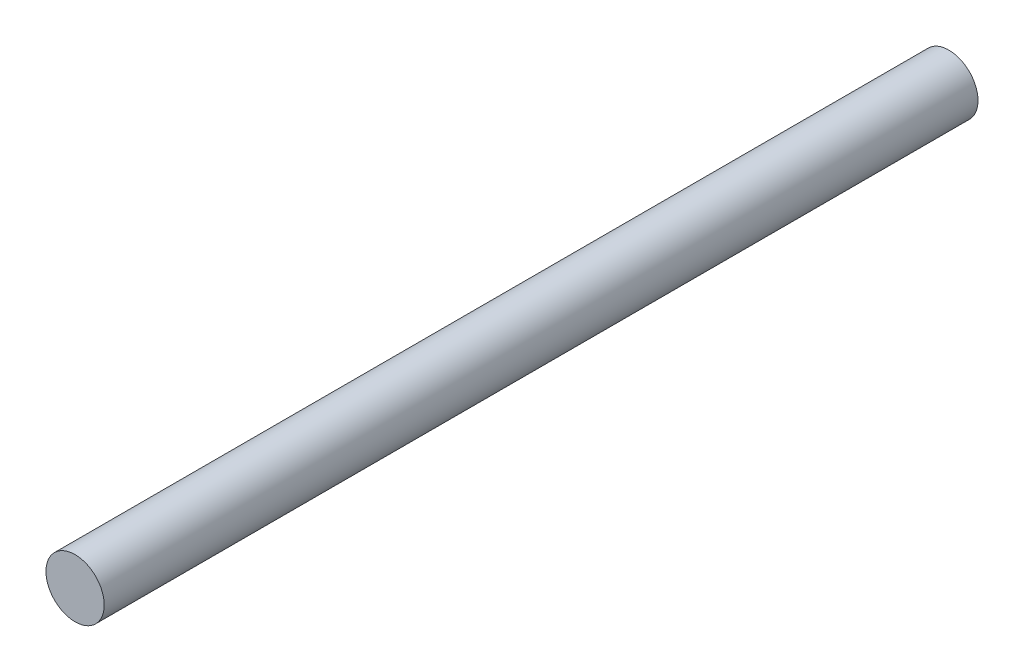
ISO-10303-21;
HEADER;
FILE_DESCRIPTION(('STEP AP214'),'2;1');
FILE_NAME('part.step','',(''),(''),'','','');
FILE_SCHEMA(('AUTOMOTIVE_DESIGN { 1 0 10303 214 1 1 1 1 }'));
ENDSEC;
DATA;
#1=APPLICATION_CONTEXT('core data for automotive mechanical design processes');
#2=APPLICATION_PROTOCOL_DEFINITION('international standard','automotive_design',2000,#1);
#3=PRODUCT_CONTEXT('',#1,'mechanical');
#4=PRODUCT('Part','Part','',(#3));
#5=PRODUCT_RELATED_PRODUCT_CATEGORY('part','',(#4));
#6=PRODUCT_DEFINITION_FORMATION('','',#4);
#7=PRODUCT_DEFINITION_CONTEXT('part definition',#1,'design');
#8=PRODUCT_DEFINITION('design','',#6,#7);
#9=PRODUCT_DEFINITION_SHAPE('','',#8);
#10=(LENGTH_UNIT() NAMED_UNIT(*) SI_UNIT(.MILLI.,.METRE.));
#11=(NAMED_UNIT(*) PLANE_ANGLE_UNIT() SI_UNIT($,.RADIAN.));
#12=(NAMED_UNIT(*) SI_UNIT($,.STERADIAN.) SOLID_ANGLE_UNIT());
#13=UNCERTAINTY_MEASURE_WITH_UNIT(LENGTH_MEASURE(1.E-05),#10,'distance_accuracy_value','');
#14=(GEOMETRIC_REPRESENTATION_CONTEXT(3) GLOBAL_UNCERTAINTY_ASSIGNED_CONTEXT((#13)) GLOBAL_UNIT_ASSIGNED_CONTEXT((#10,
#11,#12)) REPRESENTATION_CONTEXT('',''));
#15=CARTESIAN_POINT('',(0.,0.,0.));
#16=DIRECTION('',(0.,0.,1.));
#17=DIRECTION('',(1.,0.,0.));
#18=AXIS2_PLACEMENT_3D('',#15,#16,#17);
#19=CARTESIAN_POINT('',(0.,0.,120.));
#20=DIRECTION('',(0.,0.,-1.));
#21=DIRECTION('',(-1.,0.,0.));
#22=AXIS2_PLACEMENT_3D('',#19,#20,#21);
#23=CYLINDRICAL_SURFACE('',#22,4.);
#24=CARTESIAN_POINT('',(0.,0.,120.));
#25=DIRECTION('',(0.,0.,1.));
#26=DIRECTION('',(1.,0.,0.));
#27=AXIS2_PLACEMENT_3D('',#24,#25,#26);
#28=CIRCLE('',#27,4.);
#29=CARTESIAN_POINT('',(4.,0.,120.));
#30=VERTEX_POINT('',#29);
#31=EDGE_CURVE('E10',#30,#30,#28,.T.);
#32=ORIENTED_EDGE('',*,*,#31,.F.);
#33=EDGE_LOOP('',(#32));
#34=FACE_BOUND('',#33,.T.);
#35=CARTESIAN_POINT('',(0.,0.,0.));
#36=DIRECTION('',(0.,0.,1.));
#37=DIRECTION('',(1.,0.,0.));
#38=AXIS2_PLACEMENT_3D('',#35,#36,#37);
#39=CIRCLE('',#38,4.);
#40=CARTESIAN_POINT('',(4.,0.,0.));
#41=VERTEX_POINT('',#40);
#42=EDGE_CURVE('E46',#41,#41,#39,.T.);
#43=ORIENTED_EDGE('',*,*,#42,.T.);
#44=EDGE_LOOP('',(#43));
#45=FACE_BOUND('',#44,.T.);
#46=ADVANCED_FACE('F43',(#34,#45),#23,.T.);
#47=CARTESIAN_POINT('',(0.,0.,120.));
#48=DIRECTION('',(0.,0.,1.));
#49=DIRECTION('',(1.,0.,0.));
#50=AXIS2_PLACEMENT_3D('',#47,#48,#49);
#51=PLANE('',#50);
#52=ORIENTED_EDGE('',*,*,#31,.T.);
#53=EDGE_LOOP('',(#52));
#54=FACE_BOUND('',#53,.T.);
#55=ADVANCED_FACE('F60',(#54),#51,.T.);
#56=CARTESIAN_POINT('',(0.,0.,0.));
#57=DIRECTION('',(0.,0.,1.));
#58=DIRECTION('',(1.,0.,0.));
#59=AXIS2_PLACEMENT_3D('',#56,#57,#58);
#60=PLANE('',#59);
#61=ORIENTED_EDGE('',*,*,#42,.F.);
#62=EDGE_LOOP('',(#61));
#63=FACE_BOUND('',#62,.T.);
#64=ADVANCED_FACE('F58',(#63),#60,.F.);
#65=CLOSED_SHELL('',(#46,#55,#64));
#66=MANIFOLD_SOLID_BREP('B2',#65);
#67=ADVANCED_BREP_SHAPE_REPRESENTATION('',(#18,#66),#14);
#68=SHAPE_DEFINITION_REPRESENTATION(#9,#67);
ENDSEC;
END-ISO-10303-21;
